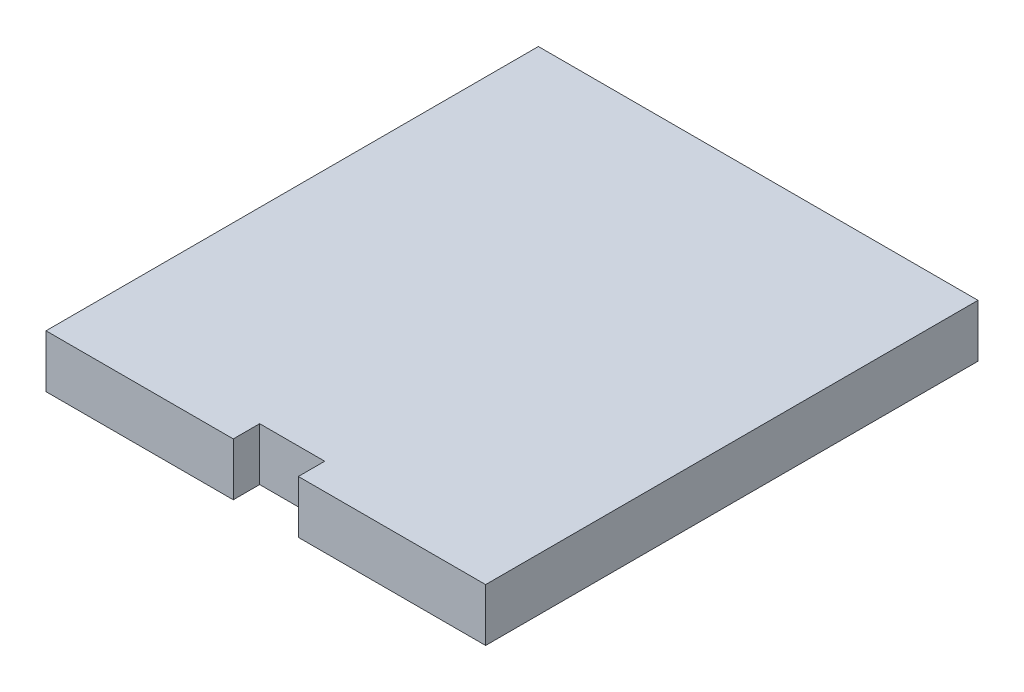
ISO-10303-21;
HEADER;
FILE_DESCRIPTION(('STEP AP214'),'2;1');
FILE_NAME('part.step','',(''),(''),'','','');
FILE_SCHEMA(('AUTOMOTIVE_DESIGN { 1 0 10303 214 1 1 1 1 }'));
ENDSEC;
DATA;
#1=APPLICATION_CONTEXT('core data for automotive mechanical design processes');
#2=APPLICATION_PROTOCOL_DEFINITION('international standard','automotive_design',2000,#1);
#3=PRODUCT_CONTEXT('',#1,'mechanical');
#4=PRODUCT('Part','Part','',(#3));
#5=PRODUCT_RELATED_PRODUCT_CATEGORY('part','',(#4));
#6=PRODUCT_DEFINITION_FORMATION('','',#4);
#7=PRODUCT_DEFINITION_CONTEXT('part definition',#1,'design');
#8=PRODUCT_DEFINITION('design','',#6,#7);
#9=PRODUCT_DEFINITION_SHAPE('','',#8);
#10=(LENGTH_UNIT() NAMED_UNIT(*) SI_UNIT(.MILLI.,.METRE.));
#11=(NAMED_UNIT(*) PLANE_ANGLE_UNIT() SI_UNIT($,.RADIAN.));
#12=(NAMED_UNIT(*) SI_UNIT($,.STERADIAN.) SOLID_ANGLE_UNIT());
#13=UNCERTAINTY_MEASURE_WITH_UNIT(LENGTH_MEASURE(1.E-05),#10,'distance_accuracy_value','');
#14=(GEOMETRIC_REPRESENTATION_CONTEXT(3) GLOBAL_UNCERTAINTY_ASSIGNED_CONTEXT((#13)) GLOBAL_UNIT_ASSIGNED_CONTEXT((#10,
#11,#12)) REPRESENTATION_CONTEXT('',''));
#15=CARTESIAN_POINT('',(0.,0.,0.));
#16=DIRECTION('',(0.,0.,1.));
#17=DIRECTION('',(1.,0.,0.));
#18=AXIS2_PLACEMENT_3D('',#15,#16,#17);
#19=CARTESIAN_POINT('',(-25.,6.,28.));
#20=DIRECTION('',(1.,0.,0.));
#21=DIRECTION('',(0.,0.,-1.));
#22=AXIS2_PLACEMENT_3D('',#19,#20,#21);
#23=PLANE('',#22);
#24=DIRECTION('',(0.,0.,1.));
#25=VECTOR('',#24,1.);
#26=CARTESIAN_POINT('',(-25.,0.,28.));
#27=LINE('',#26,#25);
#28=CARTESIAN_POINT('',(-25.,0.,-28.));
#29=VERTEX_POINT('',#28);
#30=CARTESIAN_POINT('',(-25.,0.,28.));
#31=VERTEX_POINT('',#30);
#32=EDGE_CURVE('E129',#29,#31,#27,.T.);
#33=ORIENTED_EDGE('',*,*,#32,.T.);
#34=DIRECTION('',(0.,-1.,0.));
#35=VECTOR('',#34,1.);
#36=CARTESIAN_POINT('',(-25.,6.,28.));
#37=LINE('',#36,#35);
#38=CARTESIAN_POINT('',(-25.,6.,28.));
#39=VERTEX_POINT('',#38);
#40=EDGE_CURVE('E41',#39,#31,#37,.T.);
#41=ORIENTED_EDGE('',*,*,#40,.F.);
#42=DIRECTION('',(0.,0.,1.));
#43=VECTOR('',#42,1.);
#44=CARTESIAN_POINT('',(-25.,6.,-28.));
#45=LINE('',#44,#43);
#46=CARTESIAN_POINT('',(-25.,6.,-28.));
#47=VERTEX_POINT('',#46);
#48=EDGE_CURVE('E161',#47,#39,#45,.T.);
#49=ORIENTED_EDGE('',*,*,#48,.F.);
#50=DIRECTION('',(0.,-1.,0.));
#51=VECTOR('',#50,1.);
#52=CARTESIAN_POINT('',(-25.,6.,-28.));
#53=LINE('',#52,#51);
#54=EDGE_CURVE('E11',#47,#29,#53,.T.);
#55=ORIENTED_EDGE('',*,*,#54,.T.);
#56=EDGE_LOOP('',(#33,#41,#49,#55));
#57=FACE_BOUND('',#56,.T.);
#58=ADVANCED_FACE('F33',(#57),#23,.F.);
#59=CARTESIAN_POINT('',(-23.5,6.,28.));
#60=DIRECTION('',(0.,0.,-1.));
#61=DIRECTION('',(-1.,0.,0.));
#62=AXIS2_PLACEMENT_3D('',#59,#60,#61);
#63=PLANE('',#62);
#64=DIRECTION('',(1.,0.,0.));
#65=VECTOR('',#64,1.);
#66=CARTESIAN_POINT('',(-23.5,0.,28.));
#67=LINE('',#66,#65);
#68=CARTESIAN_POINT('',(-3.7,0.,28.));
#69=VERTEX_POINT('',#68);
#70=EDGE_CURVE('E132',#31,#69,#67,.T.);
#71=ORIENTED_EDGE('',*,*,#70,.T.);
#72=DIRECTION('',(0.,-1.,0.));
#73=VECTOR('',#72,1.);
#74=CARTESIAN_POINT('',(-3.7,6.,28.));
#75=LINE('',#74,#73);
#76=CARTESIAN_POINT('',(-3.7,6.,28.));
#77=VERTEX_POINT('',#76);
#78=EDGE_CURVE('E150',#77,#69,#75,.T.);
#79=ORIENTED_EDGE('',*,*,#78,.F.);
#80=DIRECTION('',(1.,0.,0.));
#81=VECTOR('',#80,1.);
#82=CARTESIAN_POINT('',(-23.5,6.,28.));
#83=LINE('',#82,#81);
#84=EDGE_CURVE('E158',#39,#77,#83,.T.);
#85=ORIENTED_EDGE('',*,*,#84,.F.);
#86=ORIENTED_EDGE('',*,*,#40,.T.);
#87=EDGE_LOOP('',(#71,#79,#85,#86));
#88=FACE_BOUND('',#87,.T.);
#89=ADVANCED_FACE('F156',(#88),#63,.F.);
#90=CARTESIAN_POINT('',(-3.7,6.,25.));
#91=DIRECTION('',(-1.,0.,0.));
#92=DIRECTION('',(0.,0.,1.));
#93=AXIS2_PLACEMENT_3D('',#90,#91,#92);
#94=PLANE('',#93);
#95=DIRECTION('',(0.,0.,-1.));
#96=VECTOR('',#95,1.);
#97=CARTESIAN_POINT('',(-3.7,0.,25.));
#98=LINE('',#97,#96);
#99=CARTESIAN_POINT('',(-3.7,0.,25.));
#100=VERTEX_POINT('',#99);
#101=EDGE_CURVE('E134',#69,#100,#98,.T.);
#102=ORIENTED_EDGE('',*,*,#101,.T.);
#103=DIRECTION('',(0.,-1.,0.));
#104=VECTOR('',#103,1.);
#105=CARTESIAN_POINT('',(-3.7,6.,25.));
#106=LINE('',#105,#104);
#107=CARTESIAN_POINT('',(-3.7,6.,25.));
#108=VERTEX_POINT('',#107);
#109=EDGE_CURVE('E147',#108,#100,#106,.T.);
#110=ORIENTED_EDGE('',*,*,#109,.F.);
#111=DIRECTION('',(0.,0.,-1.));
#112=VECTOR('',#111,1.);
#113=CARTESIAN_POINT('',(-3.7,6.,25.));
#114=LINE('',#113,#112);
#115=EDGE_CURVE('E172',#77,#108,#114,.T.);
#116=ORIENTED_EDGE('',*,*,#115,.F.);
#117=ORIENTED_EDGE('',*,*,#78,.T.);
#118=EDGE_LOOP('',(#102,#110,#116,#117));
#119=FACE_BOUND('',#118,.T.);
#120=ADVANCED_FACE('F168',(#119),#94,.F.);
#121=CARTESIAN_POINT('',(-3.7,6.,25.));
#122=DIRECTION('',(0.,0.,-1.));
#123=DIRECTION('',(-1.,0.,0.));
#124=AXIS2_PLACEMENT_3D('',#121,#122,#123);
#125=PLANE('',#124);
#126=DIRECTION('',(1.,0.,0.));
#127=VECTOR('',#126,1.);
#128=CARTESIAN_POINT('',(-3.7,0.,25.));
#129=LINE('',#128,#127);
#130=CARTESIAN_POINT('',(3.7,0.,25.));
#131=VERTEX_POINT('',#130);
#132=EDGE_CURVE('E136',#100,#131,#129,.T.);
#133=ORIENTED_EDGE('',*,*,#132,.T.);
#134=DIRECTION('',(0.,-1.,0.));
#135=VECTOR('',#134,1.);
#136=CARTESIAN_POINT('',(3.7,6.,25.));
#137=LINE('',#136,#135);
#138=CARTESIAN_POINT('',(3.7,6.,25.));
#139=VERTEX_POINT('',#138);
#140=EDGE_CURVE('E120',#139,#131,#137,.T.);
#141=ORIENTED_EDGE('',*,*,#140,.F.);
#142=DIRECTION('',(1.,0.,0.));
#143=VECTOR('',#142,1.);
#144=CARTESIAN_POINT('',(-3.7,6.,25.));
#145=LINE('',#144,#143);
#146=EDGE_CURVE('E108',#108,#139,#145,.T.);
#147=ORIENTED_EDGE('',*,*,#146,.F.);
#148=ORIENTED_EDGE('',*,*,#109,.T.);
#149=EDGE_LOOP('',(#133,#141,#147,#148));
#150=FACE_BOUND('',#149,.T.);
#151=ADVANCED_FACE('F171',(#150),#125,.F.);
#152=CARTESIAN_POINT('',(3.7,6.,25.));
#153=DIRECTION('',(1.,0.,0.));
#154=DIRECTION('',(0.,0.,-1.));
#155=AXIS2_PLACEMENT_3D('',#152,#153,#154);
#156=PLANE('',#155);
#157=DIRECTION('',(0.,0.,1.));
#158=VECTOR('',#157,1.);
#159=CARTESIAN_POINT('',(3.7,0.,25.));
#160=LINE('',#159,#158);
#161=CARTESIAN_POINT('',(3.7,0.,28.));
#162=VERTEX_POINT('',#161);
#163=EDGE_CURVE('E118',#131,#162,#160,.T.);
#164=ORIENTED_EDGE('',*,*,#163,.T.);
#165=DIRECTION('',(0.,-1.,0.));
#166=VECTOR('',#165,1.);
#167=CARTESIAN_POINT('',(3.7,6.,28.));
#168=LINE('',#167,#166);
#169=CARTESIAN_POINT('',(3.7,6.,28.));
#170=VERTEX_POINT('',#169);
#171=EDGE_CURVE('E115',#170,#162,#168,.T.);
#172=ORIENTED_EDGE('',*,*,#171,.F.);
#173=DIRECTION('',(0.,0.,1.));
#174=VECTOR('',#173,1.);
#175=CARTESIAN_POINT('',(3.7,6.,25.));
#176=LINE('',#175,#174);
#177=EDGE_CURVE('E101',#139,#170,#176,.T.);
#178=ORIENTED_EDGE('',*,*,#177,.F.);
#179=ORIENTED_EDGE('',*,*,#140,.T.);
#180=EDGE_LOOP('',(#164,#172,#178,#179));
#181=FACE_BOUND('',#180,.T.);
#182=ADVANCED_FACE('F116',(#181),#156,.F.);
#183=CARTESIAN_POINT('',(23.5,6.,28.));
#184=DIRECTION('',(0.,0.,-1.));
#185=DIRECTION('',(-1.,0.,0.));
#186=AXIS2_PLACEMENT_3D('',#183,#184,#185);
#187=PLANE('',#186);
#188=DIRECTION('',(1.,0.,0.));
#189=VECTOR('',#188,1.);
#190=CARTESIAN_POINT('',(23.5,0.,28.));
#191=LINE('',#190,#189);
#192=CARTESIAN_POINT('',(25.,0.,28.));
#193=VERTEX_POINT('',#192);
#194=EDGE_CURVE('E139',#162,#193,#191,.T.);
#195=ORIENTED_EDGE('',*,*,#194,.T.);
#196=DIRECTION('',(0.,-1.,0.));
#197=VECTOR('',#196,1.);
#198=CARTESIAN_POINT('',(25.,6.,28.));
#199=LINE('',#198,#197);
#200=CARTESIAN_POINT('',(25.,6.,28.));
#201=VERTEX_POINT('',#200);
#202=EDGE_CURVE('E121',#201,#193,#199,.T.);
#203=ORIENTED_EDGE('',*,*,#202,.F.);
#204=DIRECTION('',(1.,0.,0.));
#205=VECTOR('',#204,1.);
#206=CARTESIAN_POINT('',(3.7,6.,28.));
#207=LINE('',#206,#205);
#208=EDGE_CURVE('E105',#170,#201,#207,.T.);
#209=ORIENTED_EDGE('',*,*,#208,.F.);
#210=ORIENTED_EDGE('',*,*,#171,.T.);
#211=EDGE_LOOP('',(#195,#203,#209,#210));
#212=FACE_BOUND('',#211,.T.);
#213=ADVANCED_FACE('F123',(#212),#187,.F.);
#214=CARTESIAN_POINT('',(25.,6.,-28.));
#215=DIRECTION('',(-1.,0.,0.));
#216=DIRECTION('',(0.,0.,1.));
#217=AXIS2_PLACEMENT_3D('',#214,#215,#216);
#218=PLANE('',#217);
#219=DIRECTION('',(0.,0.,-1.));
#220=VECTOR('',#219,1.);
#221=CARTESIAN_POINT('',(25.,0.,-28.));
#222=LINE('',#221,#220);
#223=CARTESIAN_POINT('',(25.,0.,-28.));
#224=VERTEX_POINT('',#223);
#225=EDGE_CURVE('E77',#193,#224,#222,.T.);
#226=ORIENTED_EDGE('',*,*,#225,.T.);
#227=DIRECTION('',(0.,-1.,0.));
#228=VECTOR('',#227,1.);
#229=CARTESIAN_POINT('',(25.,6.,-28.));
#230=LINE('',#229,#228);
#231=CARTESIAN_POINT('',(25.,6.,-28.));
#232=VERTEX_POINT('',#231);
#233=EDGE_CURVE('E125',#232,#224,#230,.T.);
#234=ORIENTED_EDGE('',*,*,#233,.F.);
#235=DIRECTION('',(0.,0.,-1.));
#236=VECTOR('',#235,1.);
#237=CARTESIAN_POINT('',(25.,6.,28.));
#238=LINE('',#237,#236);
#239=EDGE_CURVE('E49',#201,#232,#238,.T.);
#240=ORIENTED_EDGE('',*,*,#239,.F.);
#241=ORIENTED_EDGE('',*,*,#202,.T.);
#242=EDGE_LOOP('',(#226,#234,#240,#241));
#243=FACE_BOUND('',#242,.T.);
#244=ADVANCED_FACE('F177',(#243),#218,.F.);
#245=CARTESIAN_POINT('',(23.5,6.,-28.));
#246=DIRECTION('',(0.,0.,1.));
#247=DIRECTION('',(1.,0.,0.));
#248=AXIS2_PLACEMENT_3D('',#245,#246,#247);
#249=PLANE('',#248);
#250=DIRECTION('',(-1.,0.,0.));
#251=VECTOR('',#250,1.);
#252=CARTESIAN_POINT('',(23.5,0.,-28.));
#253=LINE('',#252,#251);
#254=EDGE_CURVE('E142',#224,#29,#253,.T.);
#255=ORIENTED_EDGE('',*,*,#254,.T.);
#256=ORIENTED_EDGE('',*,*,#54,.F.);
#257=DIRECTION('',(-1.,0.,0.));
#258=VECTOR('',#257,1.);
#259=CARTESIAN_POINT('',(-23.5,6.,-28.));
#260=LINE('',#259,#258);
#261=EDGE_CURVE('E87',#232,#47,#260,.T.);
#262=ORIENTED_EDGE('',*,*,#261,.F.);
#263=ORIENTED_EDGE('',*,*,#233,.T.);
#264=EDGE_LOOP('',(#255,#256,#262,#263));
#265=FACE_BOUND('',#264,.T.);
#266=ADVANCED_FACE('F179',(#265),#249,.F.);
#267=CARTESIAN_POINT('',(0.,6.,0.));
#268=DIRECTION('',(0.,-1.,0.));
#269=DIRECTION('',(0.,0.,-1.));
#270=AXIS2_PLACEMENT_3D('',#267,#268,#269);
#271=PLANE('',#270);
#272=ORIENTED_EDGE('',*,*,#261,.T.);
#273=ORIENTED_EDGE('',*,*,#48,.T.);
#274=ORIENTED_EDGE('',*,*,#84,.T.);
#275=ORIENTED_EDGE('',*,*,#115,.T.);
#276=ORIENTED_EDGE('',*,*,#146,.T.);
#277=ORIENTED_EDGE('',*,*,#177,.T.);
#278=ORIENTED_EDGE('',*,*,#208,.T.);
#279=ORIENTED_EDGE('',*,*,#239,.T.);
#280=EDGE_LOOP('',(#272,#273,#274,#275,#276,#277,#278,#279));
#281=FACE_BOUND('',#280,.T.);
#282=ADVANCED_FACE('F103',(#281),#271,.F.);
#283=CARTESIAN_POINT('',(0.,0.,0.));
#284=DIRECTION('',(0.,-1.,0.));
#285=DIRECTION('',(0.,0.,-1.));
#286=AXIS2_PLACEMENT_3D('',#283,#284,#285);
#287=PLANE('',#286);
#288=ORIENTED_EDGE('',*,*,#32,.F.);
#289=ORIENTED_EDGE('',*,*,#254,.F.);
#290=ORIENTED_EDGE('',*,*,#225,.F.);
#291=ORIENTED_EDGE('',*,*,#194,.F.);
#292=ORIENTED_EDGE('',*,*,#163,.F.);
#293=ORIENTED_EDGE('',*,*,#132,.F.);
#294=ORIENTED_EDGE('',*,*,#101,.F.);
#295=ORIENTED_EDGE('',*,*,#70,.F.);
#296=EDGE_LOOP('',(#288,#289,#290,#291,#292,#293,#294,#295));
#297=FACE_BOUND('',#296,.T.);
#298=ADVANCED_FACE('F163',(#297),#287,.T.);
#299=CLOSED_SHELL('',(#58,#89,#120,#151,#182,#213,#244,#266,#282,#298));
#300=MANIFOLD_SOLID_BREP('B2',#299);
#301=ADVANCED_BREP_SHAPE_REPRESENTATION('',(#18,#300),#14);
#302=SHAPE_DEFINITION_REPRESENTATION(#9,#301);
ENDSEC;
END-ISO-10303-21;
